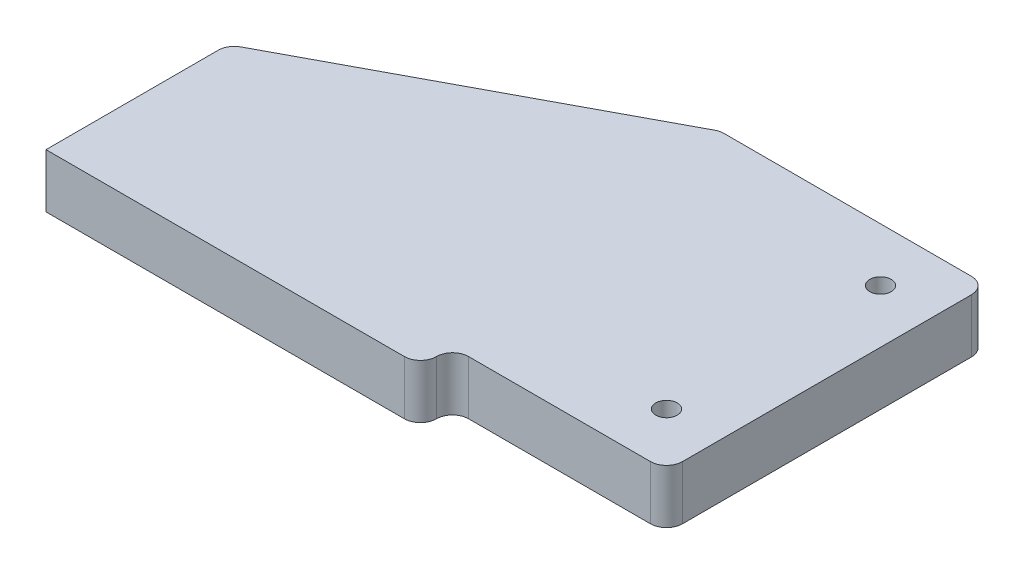
ISO-10303-21;
HEADER;
FILE_DESCRIPTION(('STEP AP214'),'2;1');
FILE_NAME('part.step','',(''),(''),'','','');
FILE_SCHEMA(('AUTOMOTIVE_DESIGN { 1 0 10303 214 1 1 1 1 }'));
ENDSEC;
DATA;
#1=APPLICATION_CONTEXT('core data for automotive mechanical design processes');
#2=APPLICATION_PROTOCOL_DEFINITION('international standard','automotive_design',2000,#1);
#3=PRODUCT_CONTEXT('',#1,'mechanical');
#4=PRODUCT('Part','Part','',(#3));
#5=PRODUCT_RELATED_PRODUCT_CATEGORY('part','',(#4));
#6=PRODUCT_DEFINITION_FORMATION('','',#4);
#7=PRODUCT_DEFINITION_CONTEXT('part definition',#1,'design');
#8=PRODUCT_DEFINITION('design','',#6,#7);
#9=PRODUCT_DEFINITION_SHAPE('','',#8);
#10=(LENGTH_UNIT() NAMED_UNIT(*) SI_UNIT(.MILLI.,.METRE.));
#11=(NAMED_UNIT(*) PLANE_ANGLE_UNIT() SI_UNIT($,.RADIAN.));
#12=(NAMED_UNIT(*) SI_UNIT($,.STERADIAN.) SOLID_ANGLE_UNIT());
#13=UNCERTAINTY_MEASURE_WITH_UNIT(LENGTH_MEASURE(1.E-05),#10,'distance_accuracy_value','');
#14=(GEOMETRIC_REPRESENTATION_CONTEXT(3) GLOBAL_UNCERTAINTY_ASSIGNED_CONTEXT((#13)) GLOBAL_UNIT_ASSIGNED_CONTEXT((#10,
#11,#12)) REPRESENTATION_CONTEXT('',''));
#15=CARTESIAN_POINT('',(0.,0.,0.));
#16=DIRECTION('',(0.,0.,1.));
#17=DIRECTION('',(1.,0.,0.));
#18=AXIS2_PLACEMENT_3D('',#15,#16,#17);
#19=CARTESIAN_POINT('',(-5.87374999999999,6.4008,-36.195));
#20=DIRECTION('',(0.,1.,0.));
#21=DIRECTION('',(0.,0.,1.));
#22=AXIS2_PLACEMENT_3D('',#19,#20,#21);
#23=PLANE('',#22);
#24=CARTESIAN_POINT('',(19.05,6.4008,-31.75));
#25=DIRECTION('',(0.,1.,0.));
#26=DIRECTION('',(0.,0.,1.));
#27=AXIS2_PLACEMENT_3D('',#24,#25,#26);
#28=CIRCLE('',#27,1.27);
#29=CARTESIAN_POINT('',(19.05,6.4008,-30.48));
#30=VERTEX_POINT('',#29);
#31=EDGE_CURVE('E157',#30,#30,#28,.T.);
#32=ORIENTED_EDGE('',*,*,#31,.F.);
#33=EDGE_LOOP('',(#32));
#34=FACE_BOUND('',#33,.T.);
#35=CARTESIAN_POINT('',(-5.87374999999999,6.4008,-36.195));
#36=DIRECTION('',(0.,1.,0.));
#37=DIRECTION('',(0.,0.,1.));
#38=AXIS2_PLACEMENT_3D('',#35,#36,#37);
#39=CIRCLE('',#38,1.905);
#40=CARTESIAN_POINT('',(-5.87374999999999,6.4008,-38.1));
#41=VERTEX_POINT('',#40);
#42=CARTESIAN_POINT('',(-6.77022058823528,6.4008,-37.8758823529412));
#43=VERTEX_POINT('',#42);
#44=EDGE_CURVE('E176',#41,#43,#39,.T.);
#45=ORIENTED_EDGE('',*,*,#44,.T.);
#46=DIRECTION('',(-0.88235294117647,0.,0.470588235294118));
#47=VECTOR('',#46,1.);
#48=CARTESIAN_POINT('',(-6.77022058823528,6.4008,-37.8758823529412));
#49=LINE('',#48,#47);
#50=CARTESIAN_POINT('',(-43.4414705882353,6.4008,-18.3178823529412));
#51=VERTEX_POINT('',#50);
#52=EDGE_CURVE('E104',#43,#51,#49,.T.);
#53=ORIENTED_EDGE('',*,*,#52,.T.);
#54=CARTESIAN_POINT('',(-42.545,6.4008,-16.637));
#55=DIRECTION('',(0.,1.,0.));
#56=DIRECTION('',(0.,0.,1.));
#57=AXIS2_PLACEMENT_3D('',#54,#55,#56);
#58=CIRCLE('',#57,1.905);
#59=CARTESIAN_POINT('',(-44.45,6.4008,-16.637));
#60=VERTEX_POINT('',#59);
#61=EDGE_CURVE('E203',#51,#60,#58,.T.);
#62=ORIENTED_EDGE('',*,*,#61,.T.);
#63=DIRECTION('',(0.,0.,1.));
#64=VECTOR('',#63,1.);
#65=CARTESIAN_POINT('',(-44.45,6.4008,-16.637));
#66=LINE('',#65,#64);
#67=CARTESIAN_POINT('',(-44.45,6.4008,3.81));
#68=VERTEX_POINT('',#67);
#69=EDGE_CURVE('E222',#60,#68,#66,.T.);
#70=ORIENTED_EDGE('',*,*,#69,.T.);
#71=DIRECTION('',(1.,0.,0.));
#72=VECTOR('',#71,1.);
#73=CARTESIAN_POINT('',(-44.45,6.4008,3.81));
#74=LINE('',#73,#72);
#75=CARTESIAN_POINT('',(-1.905,6.4008,3.81));
#76=VERTEX_POINT('',#75);
#77=EDGE_CURVE('E219',#68,#76,#74,.T.);
#78=ORIENTED_EDGE('',*,*,#77,.T.);
#79=CARTESIAN_POINT('',(-1.905,6.4008,1.905));
#80=DIRECTION('',(0.,1.,0.));
#81=DIRECTION('',(0.,0.,1.));
#82=AXIS2_PLACEMENT_3D('',#79,#80,#81);
#83=CIRCLE('',#82,1.905);
#84=CARTESIAN_POINT('',(0.,6.4008,1.905));
#85=VERTEX_POINT('',#84);
#86=EDGE_CURVE('E221',#76,#85,#83,.T.);
#87=ORIENTED_EDGE('',*,*,#86,.T.);
#88=CARTESIAN_POINT('',(1.905,6.4008,1.905));
#89=DIRECTION('',(0.,-1.,0.));
#90=DIRECTION('',(0.,0.,1.));
#91=AXIS2_PLACEMENT_3D('',#88,#89,#90);
#92=CIRCLE('',#91,1.905);
#93=CARTESIAN_POINT('',(1.905,6.4008,0.));
#94=VERTEX_POINT('',#93);
#95=EDGE_CURVE('E224',#85,#94,#92,.T.);
#96=ORIENTED_EDGE('',*,*,#95,.T.);
#97=DIRECTION('',(1.,0.,0.));
#98=VECTOR('',#97,1.);
#99=CARTESIAN_POINT('',(1.905,6.4008,0.));
#100=LINE('',#99,#98);
#101=CARTESIAN_POINT('',(23.495,6.4008,0.));
#102=VERTEX_POINT('',#101);
#103=EDGE_CURVE('E230',#94,#102,#100,.T.);
#104=ORIENTED_EDGE('',*,*,#103,.T.);
#105=CARTESIAN_POINT('',(23.495,6.4008,-1.905));
#106=DIRECTION('',(0.,1.,0.));
#107=DIRECTION('',(0.,0.,1.));
#108=AXIS2_PLACEMENT_3D('',#105,#106,#107);
#109=CIRCLE('',#108,1.905);
#110=CARTESIAN_POINT('',(25.4,6.4008,-1.905));
#111=VERTEX_POINT('',#110);
#112=EDGE_CURVE('E135',#102,#111,#109,.T.);
#113=ORIENTED_EDGE('',*,*,#112,.T.);
#114=DIRECTION('',(0.,0.,-1.));
#115=VECTOR('',#114,1.);
#116=CARTESIAN_POINT('',(25.4,6.4008,-1.905));
#117=LINE('',#116,#115);
#118=CARTESIAN_POINT('',(25.4,6.4008,-36.195));
#119=VERTEX_POINT('',#118);
#120=EDGE_CURVE('E129',#111,#119,#117,.T.);
#121=ORIENTED_EDGE('',*,*,#120,.T.);
#122=CARTESIAN_POINT('',(23.495,6.4008,-36.195));
#123=DIRECTION('',(0.,1.,0.));
#124=DIRECTION('',(0.,0.,1.));
#125=AXIS2_PLACEMENT_3D('',#122,#123,#124);
#126=CIRCLE('',#125,1.905);
#127=CARTESIAN_POINT('',(23.495,6.4008,-38.1));
#128=VERTEX_POINT('',#127);
#129=EDGE_CURVE('E133',#119,#128,#126,.T.);
#130=ORIENTED_EDGE('',*,*,#129,.T.);
#131=DIRECTION('',(-1.,0.,0.));
#132=VECTOR('',#131,1.);
#133=CARTESIAN_POINT('',(23.495,6.4008,-38.1));
#134=LINE('',#133,#132);
#135=EDGE_CURVE('E49',#128,#41,#134,.T.);
#136=ORIENTED_EDGE('',*,*,#135,.T.);
#137=EDGE_LOOP('',(#45,#53,#62,#70,#78,#87,#96,#104,#113,#121,#130,#136));
#138=FACE_BOUND('',#137,.T.);
#139=CARTESIAN_POINT('',(19.05,6.4008,-6.35));
#140=DIRECTION('',(0.,1.,0.));
#141=DIRECTION('',(0.,0.,1.));
#142=AXIS2_PLACEMENT_3D('',#139,#140,#141);
#143=CIRCLE('',#142,1.27);
#144=CARTESIAN_POINT('',(19.05,6.4008,-5.08));
#145=VERTEX_POINT('',#144);
#146=EDGE_CURVE('E273',#145,#145,#143,.T.);
#147=ORIENTED_EDGE('',*,*,#146,.F.);
#148=EDGE_LOOP('',(#147));
#149=FACE_BOUND('',#148,.T.);
#150=ADVANCED_FACE('F32',(#34,#138,#149),#23,.T.);
#151=CARTESIAN_POINT('',(-5.87374999999999,0.,-36.195));
#152=DIRECTION('',(0.,1.,0.));
#153=DIRECTION('',(0.,0.,1.));
#154=AXIS2_PLACEMENT_3D('',#151,#152,#153);
#155=PLANE('',#154);
#156=CARTESIAN_POINT('',(19.05,0.,-31.75));
#157=DIRECTION('',(0.,1.,0.));
#158=DIRECTION('',(0.,0.,1.));
#159=AXIS2_PLACEMENT_3D('',#156,#157,#158);
#160=CIRCLE('',#159,1.27);
#161=CARTESIAN_POINT('',(19.05,0.,-30.48));
#162=VERTEX_POINT('',#161);
#163=EDGE_CURVE('E278',#162,#162,#160,.T.);
#164=ORIENTED_EDGE('',*,*,#163,.T.);
#165=EDGE_LOOP('',(#164));
#166=FACE_BOUND('',#165,.T.);
#167=CARTESIAN_POINT('',(-5.87374999999999,0.,-36.195));
#168=DIRECTION('',(0.,1.,0.));
#169=DIRECTION('',(0.,0.,1.));
#170=AXIS2_PLACEMENT_3D('',#167,#168,#169);
#171=CIRCLE('',#170,1.905);
#172=CARTESIAN_POINT('',(-5.87374999999999,0.,-38.1));
#173=VERTEX_POINT('',#172);
#174=CARTESIAN_POINT('',(-6.77022058823528,0.,-37.8758823529412));
#175=VERTEX_POINT('',#174);
#176=EDGE_CURVE('E153',#173,#175,#171,.T.);
#177=ORIENTED_EDGE('',*,*,#176,.F.);
#178=DIRECTION('',(-1.,0.,0.));
#179=VECTOR('',#178,1.);
#180=CARTESIAN_POINT('',(23.495,0.,-38.1));
#181=LINE('',#180,#179);
#182=CARTESIAN_POINT('',(23.495,0.,-38.1));
#183=VERTEX_POINT('',#182);
#184=EDGE_CURVE('E96',#183,#173,#181,.T.);
#185=ORIENTED_EDGE('',*,*,#184,.F.);
#186=CARTESIAN_POINT('',(23.495,0.,-36.195));
#187=DIRECTION('',(0.,1.,0.));
#188=DIRECTION('',(0.,0.,1.));
#189=AXIS2_PLACEMENT_3D('',#186,#187,#188);
#190=CIRCLE('',#189,1.905);
#191=CARTESIAN_POINT('',(25.4,0.,-36.195));
#192=VERTEX_POINT('',#191);
#193=EDGE_CURVE('E90',#192,#183,#190,.T.);
#194=ORIENTED_EDGE('',*,*,#193,.F.);
#195=DIRECTION('',(0.,0.,-1.));
#196=VECTOR('',#195,1.);
#197=CARTESIAN_POINT('',(25.4,0.,-1.905));
#198=LINE('',#197,#196);
#199=CARTESIAN_POINT('',(25.4,0.,-1.905));
#200=VERTEX_POINT('',#199);
#201=EDGE_CURVE('E143',#200,#192,#198,.T.);
#202=ORIENTED_EDGE('',*,*,#201,.F.);
#203=CARTESIAN_POINT('',(23.495,0.,-1.905));
#204=DIRECTION('',(0.,1.,0.));
#205=DIRECTION('',(0.,0.,1.));
#206=AXIS2_PLACEMENT_3D('',#203,#204,#205);
#207=CIRCLE('',#206,1.905);
#208=CARTESIAN_POINT('',(23.495,0.,0.));
#209=VERTEX_POINT('',#208);
#210=EDGE_CURVE('E171',#209,#200,#207,.T.);
#211=ORIENTED_EDGE('',*,*,#210,.F.);
#212=DIRECTION('',(1.,0.,0.));
#213=VECTOR('',#212,1.);
#214=CARTESIAN_POINT('',(1.905,0.,0.));
#215=LINE('',#214,#213);
#216=CARTESIAN_POINT('',(1.905,0.,0.));
#217=VERTEX_POINT('',#216);
#218=EDGE_CURVE('E169',#217,#209,#215,.T.);
#219=ORIENTED_EDGE('',*,*,#218,.F.);
#220=CARTESIAN_POINT('',(1.905,0.,1.905));
#221=DIRECTION('',(0.,-1.,0.));
#222=DIRECTION('',(0.,0.,1.));
#223=AXIS2_PLACEMENT_3D('',#220,#221,#222);
#224=CIRCLE('',#223,1.905);
#225=CARTESIAN_POINT('',(0.,0.,1.905));
#226=VERTEX_POINT('',#225);
#227=EDGE_CURVE('E167',#226,#217,#224,.T.);
#228=ORIENTED_EDGE('',*,*,#227,.F.);
#229=CARTESIAN_POINT('',(-1.905,0.,1.905));
#230=DIRECTION('',(0.,1.,0.));
#231=DIRECTION('',(0.,0.,1.));
#232=AXIS2_PLACEMENT_3D('',#229,#230,#231);
#233=CIRCLE('',#232,1.905);
#234=CARTESIAN_POINT('',(-1.905,0.,3.81));
#235=VERTEX_POINT('',#234);
#236=EDGE_CURVE('E165',#235,#226,#233,.T.);
#237=ORIENTED_EDGE('',*,*,#236,.F.);
#238=DIRECTION('',(1.,0.,0.));
#239=VECTOR('',#238,1.);
#240=CARTESIAN_POINT('',(-44.45,0.,3.81));
#241=LINE('',#240,#239);
#242=CARTESIAN_POINT('',(-44.45,0.,3.81));
#243=VERTEX_POINT('',#242);
#244=EDGE_CURVE('E163',#243,#235,#241,.T.);
#245=ORIENTED_EDGE('',*,*,#244,.F.);
#246=DIRECTION('',(0.,0.,1.));
#247=VECTOR('',#246,1.);
#248=CARTESIAN_POINT('',(-44.45,0.,-16.637));
#249=LINE('',#248,#247);
#250=CARTESIAN_POINT('',(-44.45,0.,-16.637));
#251=VERTEX_POINT('',#250);
#252=EDGE_CURVE('E161',#251,#243,#249,.T.);
#253=ORIENTED_EDGE('',*,*,#252,.F.);
#254=CARTESIAN_POINT('',(-42.545,0.,-16.637));
#255=DIRECTION('',(0.,1.,0.));
#256=DIRECTION('',(0.,0.,1.));
#257=AXIS2_PLACEMENT_3D('',#254,#255,#256);
#258=CIRCLE('',#257,1.905);
#259=CARTESIAN_POINT('',(-43.4414705882353,0.,-18.3178823529412));
#260=VERTEX_POINT('',#259);
#261=EDGE_CURVE('E159',#260,#251,#258,.T.);
#262=ORIENTED_EDGE('',*,*,#261,.F.);
#263=DIRECTION('',(-0.88235294117647,0.,0.470588235294118));
#264=VECTOR('',#263,1.);
#265=CARTESIAN_POINT('',(-6.77022058823528,0.,-37.8758823529412));
#266=LINE('',#265,#264);
#267=EDGE_CURVE('E156',#175,#260,#266,.T.);
#268=ORIENTED_EDGE('',*,*,#267,.F.);
#269=EDGE_LOOP('',(#177,#185,#194,#202,#211,#219,#228,#237,#245,#253,#262,#268));
#270=FACE_BOUND('',#269,.T.);
#271=CARTESIAN_POINT('',(19.05,0.,-6.35));
#272=DIRECTION('',(0.,1.,0.));
#273=DIRECTION('',(0.,0.,1.));
#274=AXIS2_PLACEMENT_3D('',#271,#272,#273);
#275=CIRCLE('',#274,1.27);
#276=CARTESIAN_POINT('',(19.05,0.,-5.08));
#277=VERTEX_POINT('',#276);
#278=EDGE_CURVE('E276',#277,#277,#275,.T.);
#279=ORIENTED_EDGE('',*,*,#278,.T.);
#280=EDGE_LOOP('',(#279));
#281=FACE_BOUND('',#280,.T.);
#282=ADVANCED_FACE('F207',(#166,#270,#281),#155,.F.);
#283=CARTESIAN_POINT('',(-5.87374999999999,6.4008,-36.195));
#284=DIRECTION('',(0.,-1.,0.));
#285=DIRECTION('',(0.,0.,-1.));
#286=AXIS2_PLACEMENT_3D('',#283,#284,#285);
#287=CYLINDRICAL_SURFACE('',#286,1.905);
#288=ORIENTED_EDGE('',*,*,#176,.T.);
#289=DIRECTION('',(0.,-1.,0.));
#290=VECTOR('',#289,1.);
#291=CARTESIAN_POINT('',(-6.77022058823528,6.4008,-37.8758823529412));
#292=LINE('',#291,#290);
#293=EDGE_CURVE('E11',#43,#175,#292,.T.);
#294=ORIENTED_EDGE('',*,*,#293,.F.);
#295=ORIENTED_EDGE('',*,*,#44,.F.);
#296=DIRECTION('',(0.,-1.,0.));
#297=VECTOR('',#296,1.);
#298=CARTESIAN_POINT('',(-5.87374999999999,6.4008,-38.1));
#299=LINE('',#298,#297);
#300=EDGE_CURVE('E149',#41,#173,#299,.T.);
#301=ORIENTED_EDGE('',*,*,#300,.T.);
#302=EDGE_LOOP('',(#288,#294,#295,#301));
#303=FACE_BOUND('',#302,.T.);
#304=ADVANCED_FACE('F34',(#303),#287,.T.);
#305=CARTESIAN_POINT('',(-6.77022058823528,6.4008,-37.8758823529412));
#306=DIRECTION('',(0.470588235294118,0.,0.882352941176471));
#307=DIRECTION('',(0.882352941176471,0.,-0.470588235294118));
#308=AXIS2_PLACEMENT_3D('',#305,#306,#307);
#309=PLANE('',#308);
#310=ORIENTED_EDGE('',*,*,#267,.T.);
#311=DIRECTION('',(0.,-1.,0.));
#312=VECTOR('',#311,1.);
#313=CARTESIAN_POINT('',(-43.4414705882353,6.4008,-18.3178823529412));
#314=LINE('',#313,#312);
#315=EDGE_CURVE('E41',#51,#260,#314,.T.);
#316=ORIENTED_EDGE('',*,*,#315,.F.);
#317=ORIENTED_EDGE('',*,*,#52,.F.);
#318=ORIENTED_EDGE('',*,*,#293,.T.);
#319=EDGE_LOOP('',(#310,#316,#317,#318));
#320=FACE_BOUND('',#319,.T.);
#321=ADVANCED_FACE('F371',(#320),#309,.F.);
#322=CARTESIAN_POINT('',(-42.545,6.4008,-16.637));
#323=DIRECTION('',(0.,-1.,0.));
#324=DIRECTION('',(0.,0.,-1.));
#325=AXIS2_PLACEMENT_3D('',#322,#323,#324);
#326=CYLINDRICAL_SURFACE('',#325,1.905);
#327=ORIENTED_EDGE('',*,*,#261,.T.);
#328=DIRECTION('',(0.,-1.,0.));
#329=VECTOR('',#328,1.);
#330=CARTESIAN_POINT('',(-44.45,6.4008,-16.637));
#331=LINE('',#330,#329);
#332=EDGE_CURVE('E195',#60,#251,#331,.T.);
#333=ORIENTED_EDGE('',*,*,#332,.F.);
#334=ORIENTED_EDGE('',*,*,#61,.F.);
#335=ORIENTED_EDGE('',*,*,#315,.T.);
#336=EDGE_LOOP('',(#327,#333,#334,#335));
#337=FACE_BOUND('',#336,.T.);
#338=ADVANCED_FACE('F201',(#337),#326,.T.);
#339=CARTESIAN_POINT('',(-44.45,6.4008,-16.637));
#340=DIRECTION('',(1.,0.,0.));
#341=DIRECTION('',(0.,0.,-1.));
#342=AXIS2_PLACEMENT_3D('',#339,#340,#341);
#343=PLANE('',#342);
#344=ORIENTED_EDGE('',*,*,#252,.T.);
#345=DIRECTION('',(0.,-1.,0.));
#346=VECTOR('',#345,1.);
#347=CARTESIAN_POINT('',(-44.45,6.4008,3.81));
#348=LINE('',#347,#346);
#349=EDGE_CURVE('E192',#68,#243,#348,.T.);
#350=ORIENTED_EDGE('',*,*,#349,.F.);
#351=ORIENTED_EDGE('',*,*,#69,.F.);
#352=ORIENTED_EDGE('',*,*,#332,.T.);
#353=EDGE_LOOP('',(#344,#350,#351,#352));
#354=FACE_BOUND('',#353,.T.);
#355=ADVANCED_FACE('F213',(#354),#343,.F.);
#356=CARTESIAN_POINT('',(-44.45,6.4008,3.81));
#357=DIRECTION('',(0.,0.,-1.));
#358=DIRECTION('',(-1.,0.,0.));
#359=AXIS2_PLACEMENT_3D('',#356,#357,#358);
#360=PLANE('',#359);
#361=ORIENTED_EDGE('',*,*,#244,.T.);
#362=DIRECTION('',(0.,-1.,0.));
#363=VECTOR('',#362,1.);
#364=CARTESIAN_POINT('',(-1.905,6.4008,3.81));
#365=LINE('',#364,#363);
#366=EDGE_CURVE('E189',#76,#235,#365,.T.);
#367=ORIENTED_EDGE('',*,*,#366,.F.);
#368=ORIENTED_EDGE('',*,*,#77,.F.);
#369=ORIENTED_EDGE('',*,*,#349,.T.);
#370=EDGE_LOOP('',(#361,#367,#368,#369));
#371=FACE_BOUND('',#370,.T.);
#372=ADVANCED_FACE('F217',(#371),#360,.F.);
#373=CARTESIAN_POINT('',(-1.905,6.4008,1.905));
#374=DIRECTION('',(0.,-1.,0.));
#375=DIRECTION('',(0.,0.,-1.));
#376=AXIS2_PLACEMENT_3D('',#373,#374,#375);
#377=CYLINDRICAL_SURFACE('',#376,1.905);
#378=ORIENTED_EDGE('',*,*,#236,.T.);
#379=DIRECTION('',(0.,-1.,0.));
#380=VECTOR('',#379,1.);
#381=CARTESIAN_POINT('',(0.,6.4008,1.905));
#382=LINE('',#381,#380);
#383=EDGE_CURVE('E186',#85,#226,#382,.T.);
#384=ORIENTED_EDGE('',*,*,#383,.F.);
#385=ORIENTED_EDGE('',*,*,#86,.F.);
#386=ORIENTED_EDGE('',*,*,#366,.T.);
#387=EDGE_LOOP('',(#378,#384,#385,#386));
#388=FACE_BOUND('',#387,.T.);
#389=ADVANCED_FACE('F336',(#388),#377,.T.);
#390=CARTESIAN_POINT('',(1.905,6.4008,1.905));
#391=DIRECTION('',(0.,-1.,0.));
#392=DIRECTION('',(0.,0.,-1.));
#393=AXIS2_PLACEMENT_3D('',#390,#391,#392);
#394=CYLINDRICAL_SURFACE('',#393,1.905);
#395=ORIENTED_EDGE('',*,*,#227,.T.);
#396=DIRECTION('',(0.,-1.,0.));
#397=VECTOR('',#396,1.);
#398=CARTESIAN_POINT('',(1.905,6.4008,0.));
#399=LINE('',#398,#397);
#400=EDGE_CURVE('E183',#94,#217,#399,.T.);
#401=ORIENTED_EDGE('',*,*,#400,.F.);
#402=ORIENTED_EDGE('',*,*,#95,.F.);
#403=ORIENTED_EDGE('',*,*,#383,.T.);
#404=EDGE_LOOP('',(#395,#401,#402,#403));
#405=FACE_BOUND('',#404,.T.);
#406=ADVANCED_FACE('F327',(#405),#394,.F.);
#407=CARTESIAN_POINT('',(1.905,6.4008,0.));
#408=DIRECTION('',(0.,0.,-1.));
#409=DIRECTION('',(-1.,0.,0.));
#410=AXIS2_PLACEMENT_3D('',#407,#408,#409);
#411=PLANE('',#410);
#412=ORIENTED_EDGE('',*,*,#218,.T.);
#413=DIRECTION('',(0.,-1.,0.));
#414=VECTOR('',#413,1.);
#415=CARTESIAN_POINT('',(23.495,6.4008,0.));
#416=LINE('',#415,#414);
#417=EDGE_CURVE('E180',#102,#209,#416,.T.);
#418=ORIENTED_EDGE('',*,*,#417,.F.);
#419=ORIENTED_EDGE('',*,*,#103,.F.);
#420=ORIENTED_EDGE('',*,*,#400,.T.);
#421=EDGE_LOOP('',(#412,#418,#419,#420));
#422=FACE_BOUND('',#421,.T.);
#423=ADVANCED_FACE('F236',(#422),#411,.F.);
#424=CARTESIAN_POINT('',(23.495,6.4008,-1.905));
#425=DIRECTION('',(0.,-1.,0.));
#426=DIRECTION('',(0.,0.,-1.));
#427=AXIS2_PLACEMENT_3D('',#424,#425,#426);
#428=CYLINDRICAL_SURFACE('',#427,1.905);
#429=ORIENTED_EDGE('',*,*,#210,.T.);
#430=DIRECTION('',(0.,-1.,0.));
#431=VECTOR('',#430,1.);
#432=CARTESIAN_POINT('',(25.4,6.4008,-1.905));
#433=LINE('',#432,#431);
#434=EDGE_CURVE('E144',#111,#200,#433,.T.);
#435=ORIENTED_EDGE('',*,*,#434,.F.);
#436=ORIENTED_EDGE('',*,*,#112,.F.);
#437=ORIENTED_EDGE('',*,*,#417,.T.);
#438=EDGE_LOOP('',(#429,#435,#436,#437));
#439=FACE_BOUND('',#438,.T.);
#440=ADVANCED_FACE('F240',(#439),#428,.T.);
#441=CARTESIAN_POINT('',(25.4,6.4008,-1.905));
#442=DIRECTION('',(-1.,0.,0.));
#443=DIRECTION('',(0.,0.,1.));
#444=AXIS2_PLACEMENT_3D('',#441,#442,#443);
#445=PLANE('',#444);
#446=ORIENTED_EDGE('',*,*,#201,.T.);
#447=DIRECTION('',(0.,-1.,0.));
#448=VECTOR('',#447,1.);
#449=CARTESIAN_POINT('',(25.4,6.4008,-36.195));
#450=LINE('',#449,#448);
#451=EDGE_CURVE('E140',#119,#192,#450,.T.);
#452=ORIENTED_EDGE('',*,*,#451,.F.);
#453=ORIENTED_EDGE('',*,*,#120,.F.);
#454=ORIENTED_EDGE('',*,*,#434,.T.);
#455=EDGE_LOOP('',(#446,#452,#453,#454));
#456=FACE_BOUND('',#455,.T.);
#457=ADVANCED_FACE('F141',(#456),#445,.F.);
#458=CARTESIAN_POINT('',(23.495,6.4008,-36.195));
#459=DIRECTION('',(0.,-1.,0.));
#460=DIRECTION('',(0.,0.,-1.));
#461=AXIS2_PLACEMENT_3D('',#458,#459,#460);
#462=CYLINDRICAL_SURFACE('',#461,1.905);
#463=ORIENTED_EDGE('',*,*,#193,.T.);
#464=DIRECTION('',(0.,-1.,0.));
#465=VECTOR('',#464,1.);
#466=CARTESIAN_POINT('',(23.495,6.4008,-38.1));
#467=LINE('',#466,#465);
#468=EDGE_CURVE('E145',#128,#183,#467,.T.);
#469=ORIENTED_EDGE('',*,*,#468,.F.);
#470=ORIENTED_EDGE('',*,*,#129,.F.);
#471=ORIENTED_EDGE('',*,*,#451,.T.);
#472=EDGE_LOOP('',(#463,#469,#470,#471));
#473=FACE_BOUND('',#472,.T.);
#474=ADVANCED_FACE('F147',(#473),#462,.T.);
#475=CARTESIAN_POINT('',(23.495,6.4008,-38.1));
#476=DIRECTION('',(0.,0.,1.));
#477=DIRECTION('',(1.,0.,0.));
#478=AXIS2_PLACEMENT_3D('',#475,#476,#477);
#479=PLANE('',#478);
#480=ORIENTED_EDGE('',*,*,#184,.T.);
#481=ORIENTED_EDGE('',*,*,#300,.F.);
#482=ORIENTED_EDGE('',*,*,#135,.F.);
#483=ORIENTED_EDGE('',*,*,#468,.T.);
#484=EDGE_LOOP('',(#480,#481,#482,#483));
#485=FACE_BOUND('',#484,.T.);
#486=ADVANCED_FACE('F244',(#485),#479,.F.);
#487=CARTESIAN_POINT('',(19.05,6.4008,-31.75));
#488=DIRECTION('',(0.,-1.,0.));
#489=DIRECTION('',(0.,0.,-1.));
#490=AXIS2_PLACEMENT_3D('',#487,#488,#489);
#491=CYLINDRICAL_SURFACE('',#490,1.27);
#492=ORIENTED_EDGE('',*,*,#31,.T.);
#493=EDGE_LOOP('',(#492));
#494=FACE_BOUND('',#493,.T.);
#495=ORIENTED_EDGE('',*,*,#163,.F.);
#496=EDGE_LOOP('',(#495));
#497=FACE_BOUND('',#496,.T.);
#498=ADVANCED_FACE('F246',(#494,#497),#491,.F.);
#499=CARTESIAN_POINT('',(19.05,6.4008,-6.35));
#500=DIRECTION('',(0.,-1.,0.));
#501=DIRECTION('',(0.,0.,-1.));
#502=AXIS2_PLACEMENT_3D('',#499,#500,#501);
#503=CYLINDRICAL_SURFACE('',#502,1.27);
#504=ORIENTED_EDGE('',*,*,#146,.T.);
#505=EDGE_LOOP('',(#504));
#506=FACE_BOUND('',#505,.T.);
#507=ORIENTED_EDGE('',*,*,#278,.F.);
#508=EDGE_LOOP('',(#507));
#509=FACE_BOUND('',#508,.T.);
#510=ADVANCED_FACE('F252',(#506,#509),#503,.F.);
#511=CLOSED_SHELL('',(#150,#282,#304,#321,#338,#355,#372,#389,#406,#423,#440,#457,#474,#486,
#498,#510));
#512=MANIFOLD_SOLID_BREP('B2',#511);
#513=ADVANCED_BREP_SHAPE_REPRESENTATION('',(#18,#512),#14);
#514=SHAPE_DEFINITION_REPRESENTATION(#9,#513);
ENDSEC;
END-ISO-10303-21;
